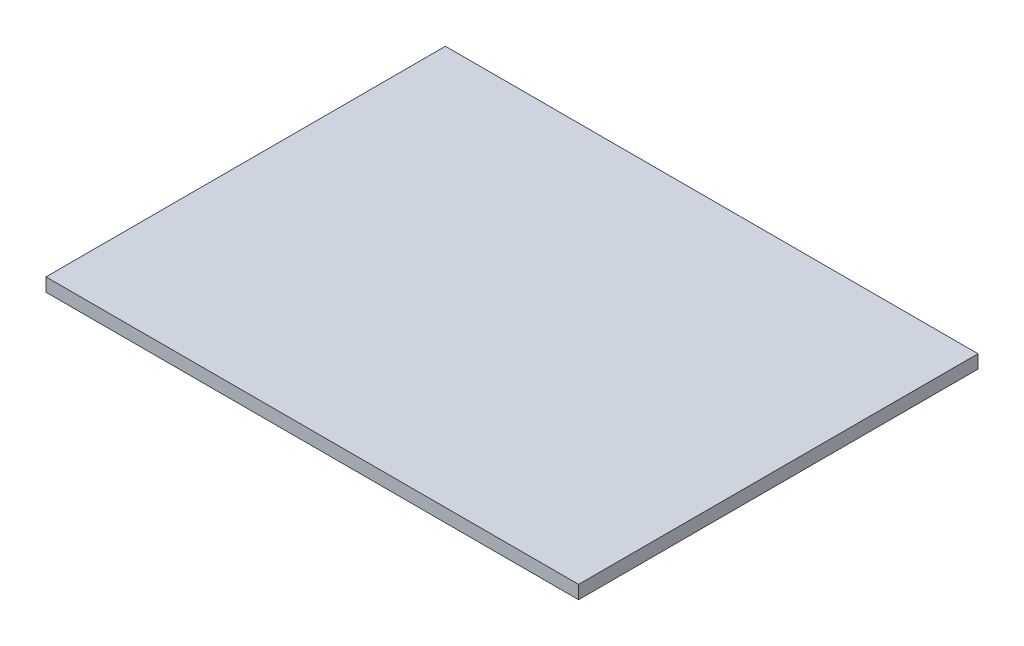
ISO-10303-21;
HEADER;
FILE_DESCRIPTION(('STEP AP214'),'2;1');
FILE_NAME('part.step','',(''),(''),'','','');
FILE_SCHEMA(('AUTOMOTIVE_DESIGN { 1 0 10303 214 1 1 1 1 }'));
ENDSEC;
DATA;
#1=APPLICATION_CONTEXT('core data for automotive mechanical design processes');
#2=APPLICATION_PROTOCOL_DEFINITION('international standard','automotive_design',2000,#1);
#3=PRODUCT_CONTEXT('',#1,'mechanical');
#4=PRODUCT('Part','Part','',(#3));
#5=PRODUCT_RELATED_PRODUCT_CATEGORY('part','',(#4));
#6=PRODUCT_DEFINITION_FORMATION('','',#4);
#7=PRODUCT_DEFINITION_CONTEXT('part definition',#1,'design');
#8=PRODUCT_DEFINITION('design','',#6,#7);
#9=PRODUCT_DEFINITION_SHAPE('','',#8);
#10=(LENGTH_UNIT() NAMED_UNIT(*) SI_UNIT(.MILLI.,.METRE.));
#11=(NAMED_UNIT(*) PLANE_ANGLE_UNIT() SI_UNIT($,.RADIAN.));
#12=(NAMED_UNIT(*) SI_UNIT($,.STERADIAN.) SOLID_ANGLE_UNIT());
#13=UNCERTAINTY_MEASURE_WITH_UNIT(LENGTH_MEASURE(1.E-05),#10,'distance_accuracy_value','');
#14=(GEOMETRIC_REPRESENTATION_CONTEXT(3) GLOBAL_UNCERTAINTY_ASSIGNED_CONTEXT((#13)) GLOBAL_UNIT_ASSIGNED_CONTEXT((#10,
#11,#12)) REPRESENTATION_CONTEXT('',''));
#15=CARTESIAN_POINT('',(0.,0.,0.));
#16=DIRECTION('',(0.,0.,1.));
#17=DIRECTION('',(1.,0.,0.));
#18=AXIS2_PLACEMENT_3D('',#15,#16,#17);
#19=CARTESIAN_POINT('',(-254.,12.7,-190.5));
#20=DIRECTION('',(1.,0.,0.));
#21=DIRECTION('',(0.,0.,-1.));
#22=AXIS2_PLACEMENT_3D('',#19,#20,#21);
#23=PLANE('',#22);
#24=DIRECTION('',(0.,0.,1.));
#25=VECTOR('',#24,1.);
#26=CARTESIAN_POINT('',(-254.,0.,-190.5));
#27=LINE('',#26,#25);
#28=CARTESIAN_POINT('',(-254.,0.,-190.5));
#29=VERTEX_POINT('',#28);
#30=CARTESIAN_POINT('',(-254.,0.,190.5));
#31=VERTEX_POINT('',#30);
#32=EDGE_CURVE('E97',#29,#31,#27,.T.);
#33=ORIENTED_EDGE('',*,*,#32,.T.);
#34=DIRECTION('',(0.,-1.,0.));
#35=VECTOR('',#34,1.);
#36=CARTESIAN_POINT('',(-254.,12.7,190.5));
#37=LINE('',#36,#35);
#38=CARTESIAN_POINT('',(-254.,12.7,190.5));
#39=VERTEX_POINT('',#38);
#40=EDGE_CURVE('E11',#39,#31,#37,.T.);
#41=ORIENTED_EDGE('',*,*,#40,.F.);
#42=DIRECTION('',(0.,0.,1.));
#43=VECTOR('',#42,1.);
#44=CARTESIAN_POINT('',(-254.,12.7,-190.5));
#45=LINE('',#44,#43);
#46=CARTESIAN_POINT('',(-254.,12.7,-190.5));
#47=VERTEX_POINT('',#46);
#48=EDGE_CURVE('E85',#47,#39,#45,.T.);
#49=ORIENTED_EDGE('',*,*,#48,.F.);
#50=DIRECTION('',(0.,-1.,0.));
#51=VECTOR('',#50,1.);
#52=CARTESIAN_POINT('',(-254.,12.7,-190.5));
#53=LINE('',#52,#51);
#54=EDGE_CURVE('E93',#47,#29,#53,.T.);
#55=ORIENTED_EDGE('',*,*,#54,.T.);
#56=EDGE_LOOP('',(#33,#41,#49,#55));
#57=FACE_BOUND('',#56,.T.);
#58=ADVANCED_FACE('F34',(#57),#23,.F.);
#59=CARTESIAN_POINT('',(-254.,12.7,190.5));
#60=DIRECTION('',(0.,0.,-1.));
#61=DIRECTION('',(-1.,0.,0.));
#62=AXIS2_PLACEMENT_3D('',#59,#60,#61);
#63=PLANE('',#62);
#64=DIRECTION('',(1.,0.,0.));
#65=VECTOR('',#64,1.);
#66=CARTESIAN_POINT('',(-254.,0.,190.5));
#67=LINE('',#66,#65);
#68=CARTESIAN_POINT('',(254.,0.,190.5));
#69=VERTEX_POINT('',#68);
#70=EDGE_CURVE('E89',#31,#69,#67,.T.);
#71=ORIENTED_EDGE('',*,*,#70,.T.);
#72=DIRECTION('',(0.,-1.,0.));
#73=VECTOR('',#72,1.);
#74=CARTESIAN_POINT('',(254.,12.7,190.5));
#75=LINE('',#74,#73);
#76=CARTESIAN_POINT('',(254.,12.7,190.5));
#77=VERTEX_POINT('',#76);
#78=EDGE_CURVE('E42',#77,#69,#75,.T.);
#79=ORIENTED_EDGE('',*,*,#78,.F.);
#80=DIRECTION('',(1.,0.,0.));
#81=VECTOR('',#80,1.);
#82=CARTESIAN_POINT('',(-254.,12.7,190.5));
#83=LINE('',#82,#81);
#84=EDGE_CURVE('E80',#39,#77,#83,.T.);
#85=ORIENTED_EDGE('',*,*,#84,.F.);
#86=ORIENTED_EDGE('',*,*,#40,.T.);
#87=EDGE_LOOP('',(#71,#79,#85,#86));
#88=FACE_BOUND('',#87,.T.);
#89=ADVANCED_FACE('F88',(#88),#63,.F.);
#90=CARTESIAN_POINT('',(254.,12.7,-190.5));
#91=DIRECTION('',(-1.,0.,0.));
#92=DIRECTION('',(0.,0.,1.));
#93=AXIS2_PLACEMENT_3D('',#90,#91,#92);
#94=PLANE('',#93);
#95=DIRECTION('',(0.,0.,-1.));
#96=VECTOR('',#95,1.);
#97=CARTESIAN_POINT('',(254.,0.,-190.5));
#98=LINE('',#97,#96);
#99=CARTESIAN_POINT('',(254.,0.,-190.5));
#100=VERTEX_POINT('',#99);
#101=EDGE_CURVE('E67',#69,#100,#98,.T.);
#102=ORIENTED_EDGE('',*,*,#101,.T.);
#103=DIRECTION('',(0.,-1.,0.));
#104=VECTOR('',#103,1.);
#105=CARTESIAN_POINT('',(254.,12.7,-190.5));
#106=LINE('',#105,#104);
#107=CARTESIAN_POINT('',(254.,12.7,-190.5));
#108=VERTEX_POINT('',#107);
#109=EDGE_CURVE('E90',#108,#100,#106,.T.);
#110=ORIENTED_EDGE('',*,*,#109,.F.);
#111=DIRECTION('',(0.,0.,-1.));
#112=VECTOR('',#111,1.);
#113=CARTESIAN_POINT('',(254.,12.7,-190.5));
#114=LINE('',#113,#112);
#115=EDGE_CURVE('E83',#77,#108,#114,.T.);
#116=ORIENTED_EDGE('',*,*,#115,.F.);
#117=ORIENTED_EDGE('',*,*,#78,.T.);
#118=EDGE_LOOP('',(#102,#110,#116,#117));
#119=FACE_BOUND('',#118,.T.);
#120=ADVANCED_FACE('F91',(#119),#94,.F.);
#121=CARTESIAN_POINT('',(-254.,12.7,-190.5));
#122=DIRECTION('',(0.,0.,1.));
#123=DIRECTION('',(1.,0.,0.));
#124=AXIS2_PLACEMENT_3D('',#121,#122,#123);
#125=PLANE('',#124);
#126=DIRECTION('',(-1.,0.,0.));
#127=VECTOR('',#126,1.);
#128=CARTESIAN_POINT('',(-254.,0.,-190.5));
#129=LINE('',#128,#127);
#130=EDGE_CURVE('E73',#100,#29,#129,.T.);
#131=ORIENTED_EDGE('',*,*,#130,.T.);
#132=ORIENTED_EDGE('',*,*,#54,.F.);
#133=DIRECTION('',(-1.,0.,0.));
#134=VECTOR('',#133,1.);
#135=CARTESIAN_POINT('',(-254.,12.7,-190.5));
#136=LINE('',#135,#134);
#137=EDGE_CURVE('E50',#108,#47,#136,.T.);
#138=ORIENTED_EDGE('',*,*,#137,.F.);
#139=ORIENTED_EDGE('',*,*,#109,.T.);
#140=EDGE_LOOP('',(#131,#132,#138,#139));
#141=FACE_BOUND('',#140,.T.);
#142=ADVANCED_FACE('F104',(#141),#125,.F.);
#143=CARTESIAN_POINT('',(0.,12.7,0.));
#144=DIRECTION('',(0.,1.,0.));
#145=DIRECTION('',(0.,0.,1.));
#146=AXIS2_PLACEMENT_3D('',#143,#144,#145);
#147=PLANE('',#146);
#148=ORIENTED_EDGE('',*,*,#48,.T.);
#149=ORIENTED_EDGE('',*,*,#84,.T.);
#150=ORIENTED_EDGE('',*,*,#115,.T.);
#151=ORIENTED_EDGE('',*,*,#137,.T.);
#152=EDGE_LOOP('',(#148,#149,#150,#151));
#153=FACE_BOUND('',#152,.T.);
#154=ADVANCED_FACE('F81',(#153),#147,.T.);
#155=CARTESIAN_POINT('',(0.,0.,0.));
#156=DIRECTION('',(0.,1.,0.));
#157=DIRECTION('',(0.,0.,1.));
#158=AXIS2_PLACEMENT_3D('',#155,#156,#157);
#159=PLANE('',#158);
#160=ORIENTED_EDGE('',*,*,#32,.F.);
#161=ORIENTED_EDGE('',*,*,#130,.F.);
#162=ORIENTED_EDGE('',*,*,#101,.F.);
#163=ORIENTED_EDGE('',*,*,#70,.F.);
#164=EDGE_LOOP('',(#160,#161,#162,#163));
#165=FACE_BOUND('',#164,.T.);
#166=ADVANCED_FACE('F107',(#165),#159,.F.);
#167=CLOSED_SHELL('',(#58,#89,#120,#142,#154,#166));
#168=MANIFOLD_SOLID_BREP('B2',#167);
#169=ADVANCED_BREP_SHAPE_REPRESENTATION('',(#18,#168),#14);
#170=SHAPE_DEFINITION_REPRESENTATION(#9,#169);
ENDSEC;
END-ISO-10303-21;
